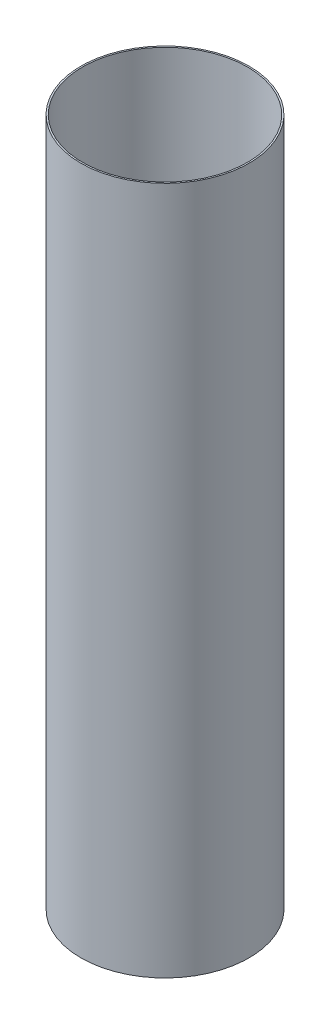
ISO-10303-21;
HEADER;
FILE_DESCRIPTION(('STEP AP214'),'2;1');
FILE_NAME('part.step','',(''),(''),'','','');
FILE_SCHEMA(('AUTOMOTIVE_DESIGN { 1 0 10303 214 1 1 1 1 }'));
ENDSEC;
DATA;
#1=APPLICATION_CONTEXT('core data for automotive mechanical design processes');
#2=APPLICATION_PROTOCOL_DEFINITION('international standard','automotive_design',2000,#1);
#3=PRODUCT_CONTEXT('',#1,'mechanical');
#4=PRODUCT('Part','Part','',(#3));
#5=PRODUCT_RELATED_PRODUCT_CATEGORY('part','',(#4));
#6=PRODUCT_DEFINITION_FORMATION('','',#4);
#7=PRODUCT_DEFINITION_CONTEXT('part definition',#1,'design');
#8=PRODUCT_DEFINITION('design','',#6,#7);
#9=PRODUCT_DEFINITION_SHAPE('','',#8);
#10=(LENGTH_UNIT() NAMED_UNIT(*) SI_UNIT(.MILLI.,.METRE.));
#11=(NAMED_UNIT(*) PLANE_ANGLE_UNIT() SI_UNIT($,.RADIAN.));
#12=(NAMED_UNIT(*) SI_UNIT($,.STERADIAN.) SOLID_ANGLE_UNIT());
#13=UNCERTAINTY_MEASURE_WITH_UNIT(LENGTH_MEASURE(1.E-05),#10,'distance_accuracy_value','');
#14=(GEOMETRIC_REPRESENTATION_CONTEXT(3) GLOBAL_UNCERTAINTY_ASSIGNED_CONTEXT((#13)) GLOBAL_UNIT_ASSIGNED_CONTEXT((#10,
#11,#12)) REPRESENTATION_CONTEXT('',''));
#15=CARTESIAN_POINT('',(0.,0.,0.));
#16=DIRECTION('',(0.,0.,1.));
#17=DIRECTION('',(1.,0.,0.));
#18=AXIS2_PLACEMENT_3D('',#15,#16,#17);
#19=CARTESIAN_POINT('',(0.,317.5,0.));
#20=DIRECTION('',(0.,1.,0.));
#21=DIRECTION('',(0.,0.,1.));
#22=AXIS2_PLACEMENT_3D('',#19,#20,#21);
#23=PLANE('',#22);
#24=CARTESIAN_POINT('',(0.,317.5,0.));
#25=DIRECTION('',(0.,1.,0.));
#26=DIRECTION('',(0.,0.,1.));
#27=AXIS2_PLACEMENT_3D('',#24,#25,#26);
#28=CIRCLE('',#27,77.6224);
#29=CARTESIAN_POINT('',(0.,317.5,-77.6224));
#30=VERTEX_POINT('',#29);
#31=EDGE_CURVE('E10',#30,#30,#28,.T.);
#32=ORIENTED_EDGE('',*,*,#31,.T.);
#33=EDGE_LOOP('',(#32));
#34=FACE_BOUND('',#33,.T.);
#35=CARTESIAN_POINT('',(0.,317.5,0.));
#36=DIRECTION('',(0.,1.,0.));
#37=DIRECTION('',(0.,0.,1.));
#38=AXIS2_PLACEMENT_3D('',#35,#36,#37);
#39=CIRCLE('',#38,76.2);
#40=CARTESIAN_POINT('',(0.,317.5,-76.2));
#41=VERTEX_POINT('',#40);
#42=EDGE_CURVE('E51',#41,#41,#39,.T.);
#43=ORIENTED_EDGE('',*,*,#42,.F.);
#44=EDGE_LOOP('',(#43));
#45=FACE_BOUND('',#44,.T.);
#46=ADVANCED_FACE('F37',(#34,#45),#23,.T.);
#47=CARTESIAN_POINT('',(0.,-317.5,0.));
#48=DIRECTION('',(0.,1.,0.));
#49=DIRECTION('',(0.,0.,1.));
#50=AXIS2_PLACEMENT_3D('',#47,#48,#49);
#51=PLANE('',#50);
#52=CARTESIAN_POINT('',(0.,-317.5,0.));
#53=DIRECTION('',(0.,1.,0.));
#54=DIRECTION('',(0.,0.,1.));
#55=AXIS2_PLACEMENT_3D('',#52,#53,#54);
#56=CIRCLE('',#55,77.6224);
#57=CARTESIAN_POINT('',(0.,-317.5,-77.6224));
#58=VERTEX_POINT('',#57);
#59=EDGE_CURVE('E41',#58,#58,#56,.T.);
#60=ORIENTED_EDGE('',*,*,#59,.F.);
#61=EDGE_LOOP('',(#60));
#62=FACE_BOUND('',#61,.T.);
#63=CARTESIAN_POINT('',(0.,-317.5,0.));
#64=DIRECTION('',(0.,1.,0.));
#65=DIRECTION('',(0.,0.,1.));
#66=AXIS2_PLACEMENT_3D('',#63,#64,#65);
#67=CIRCLE('',#66,76.2);
#68=CARTESIAN_POINT('',(0.,-317.5,-76.2));
#69=VERTEX_POINT('',#68);
#70=EDGE_CURVE('E53',#69,#69,#67,.T.);
#71=ORIENTED_EDGE('',*,*,#70,.T.);
#72=EDGE_LOOP('',(#71));
#73=FACE_BOUND('',#72,.T.);
#74=ADVANCED_FACE('F66',(#62,#73),#51,.F.);
#75=CARTESIAN_POINT('',(0.,317.5,0.));
#76=DIRECTION('',(0.,-1.,0.));
#77=DIRECTION('',(0.,0.,-1.));
#78=AXIS2_PLACEMENT_3D('',#75,#76,#77);
#79=CYLINDRICAL_SURFACE('',#78,77.6224);
#80=CARTESIAN_POINT('',(0.,317.5,-77.6224));
#81=CARTESIAN_POINT('',(0.,310.885416666667,-77.6224));
#82=CARTESIAN_POINT('',(0.,304.270833333333,-77.6224));
#83=CARTESIAN_POINT('',(0.,291.041666666667,-77.6224));
#84=CARTESIAN_POINT('',(0.,284.427083333333,-77.6224));
#85=CARTESIAN_POINT('',(0.,271.197916666667,-77.6224));
#86=CARTESIAN_POINT('',(0.,264.583333333333,-77.6224));
#87=CARTESIAN_POINT('',(0.,251.354166666667,-77.6224));
#88=CARTESIAN_POINT('',(0.,244.739583333333,-77.6224));
#89=CARTESIAN_POINT('',(0.,231.510416666667,-77.6224));
#90=CARTESIAN_POINT('',(0.,224.895833333333,-77.6224));
#91=CARTESIAN_POINT('',(0.,211.666666666667,-77.6224));
#92=CARTESIAN_POINT('',(0.,205.052083333333,-77.6224));
#93=CARTESIAN_POINT('',(0.,191.822916666667,-77.6224));
#94=CARTESIAN_POINT('',(0.,185.208333333333,-77.6224));
#95=CARTESIAN_POINT('',(0.,171.979166666667,-77.6224));
#96=CARTESIAN_POINT('',(0.,165.364583333333,-77.6224));
#97=CARTESIAN_POINT('',(0.,152.135416666667,-77.6224));
#98=CARTESIAN_POINT('',(0.,145.520833333333,-77.6224));
#99=CARTESIAN_POINT('',(0.,132.291666666667,-77.6224));
#100=CARTESIAN_POINT('',(0.,125.677083333333,-77.6224));
#101=CARTESIAN_POINT('',(0.,112.447916666667,-77.6224));
#102=CARTESIAN_POINT('',(0.,105.833333333333,-77.6224));
#103=CARTESIAN_POINT('',(0.,92.6041666666666,-77.6224));
#104=CARTESIAN_POINT('',(0.,85.9895833333332,-77.6224));
#105=CARTESIAN_POINT('',(0.,72.7604166666666,-77.6224));
#106=CARTESIAN_POINT('',(0.,66.1458333333333,-77.6224));
#107=CARTESIAN_POINT('',(0.,52.9166666666666,-77.6224));
#108=CARTESIAN_POINT('',(0.,46.3020833333332,-77.6224));
#109=CARTESIAN_POINT('',(0.,33.0729166666666,-77.6224));
#110=CARTESIAN_POINT('',(0.,26.4583333333332,-77.6224));
#111=CARTESIAN_POINT('',(0.,13.2291666666665,-77.6224));
#112=CARTESIAN_POINT('',(0.,6.61458333333322,-77.6224));
#113=CARTESIAN_POINT('',(0.,-6.61458333333344,-77.6224));
#114=CARTESIAN_POINT('',(0.,-13.2291666666668,-77.6224));
#115=CARTESIAN_POINT('',(0.,-26.4583333333334,-77.6224));
#116=CARTESIAN_POINT('',(0.,-33.0729166666668,-77.6224));
#117=CARTESIAN_POINT('',(0.,-46.3020833333334,-77.6224));
#118=CARTESIAN_POINT('',(0.,-52.9166666666668,-77.6224));
#119=CARTESIAN_POINT('',(0.,-66.1458333333335,-77.6224));
#120=CARTESIAN_POINT('',(0.,-72.7604166666668,-77.6224));
#121=CARTESIAN_POINT('',(0.,-85.9895833333335,-77.6224));
#122=CARTESIAN_POINT('',(0.,-92.6041666666668,-77.6224));
#123=CARTESIAN_POINT('',(0.,-105.833333333333,-77.6224));
#124=CARTESIAN_POINT('',(0.,-112.447916666667,-77.6224));
#125=CARTESIAN_POINT('',(0.,-125.677083333334,-77.6224));
#126=CARTESIAN_POINT('',(0.,-132.291666666667,-77.6224));
#127=CARTESIAN_POINT('',(0.,-145.520833333334,-77.6224));
#128=CARTESIAN_POINT('',(0.,-152.135416666667,-77.6224));
#129=CARTESIAN_POINT('',(0.,-165.364583333334,-77.6224));
#130=CARTESIAN_POINT('',(0.,-171.979166666667,-77.6224));
#131=CARTESIAN_POINT('',(0.,-185.208333333333,-77.6224));
#132=CARTESIAN_POINT('',(0.,-191.822916666667,-77.6224));
#133=CARTESIAN_POINT('',(0.,-205.052083333333,-77.6224));
#134=CARTESIAN_POINT('',(0.,-211.666666666667,-77.6224));
#135=CARTESIAN_POINT('',(0.,-224.895833333333,-77.6224));
#136=CARTESIAN_POINT('',(0.,-231.510416666667,-77.6224));
#137=CARTESIAN_POINT('',(0.,-244.739583333333,-77.6224));
#138=CARTESIAN_POINT('',(0.,-251.354166666667,-77.6224));
#139=CARTESIAN_POINT('',(0.,-264.583333333333,-77.6224));
#140=CARTESIAN_POINT('',(0.,-271.197916666667,-77.6224));
#141=CARTESIAN_POINT('',(0.,-284.427083333333,-77.6224));
#142=CARTESIAN_POINT('',(0.,-291.041666666667,-77.6224));
#143=CARTESIAN_POINT('',(0.,-304.270833333333,-77.6224));
#144=CARTESIAN_POINT('',(0.,-310.885416666667,-77.6224));
#145=CARTESIAN_POINT('',(0.,-317.5,-77.6224));
#146=B_SPLINE_CURVE_WITH_KNOTS('',3,(#80,#81,#82,#83,#84,#85,#86,#87,#88,#89,#90,#91,#92,#93,
#94,#95,#96,#97,#98,#99,#100,#101,#102,#103,#104,#105,#106,#107,#108,#109,#110,#111,#112,#113,
#114,#115,#116,#117,#118,#119,#120,#121,#122,#123,#124,#125,#126,#127,#128,#129,#130,#131,#132,
#133,#134,#135,#136,#137,#138,#139,#140,#141,#142,#143,#144,#145),.UNSPECIFIED.,.F.,.F.,(4,2,2,
2,2,2,2,2,2,2,2,2,2,2,2,2,2,2,2,2,2,2,2,2,2,2,2,2,2,2,2,2,4),(0.,19.84375,39.6875,59.53125,
79.375,99.21875,119.0625,138.90625,158.75,178.59375,198.4375,218.28125,238.125,257.96875,
277.8125,297.65625,317.5,337.34375,357.1875,377.03125,396.875,416.71875,436.5625,456.40625,
476.25,496.09375,515.9375,535.78125,555.625,575.46875,595.3125,615.15625,635.),.UNSPECIFIED.);
#147=EDGE_CURVE('BSEAM39',#30,#58,#146,.T.);
#148=ORIENTED_EDGE('',*,*,#31,.F.);
#149=ORIENTED_EDGE('',*,*,#59,.T.);
#150=ORIENTED_EDGE('',*,*,#147,.T.);
#151=ORIENTED_EDGE('',*,*,#147,.F.);
#152=EDGE_LOOP('',(#148,#150,#149,#151));
#153=FACE_BOUND('',#152,.T.);
#154=ADVANCED_FACE('F39',(#153),#79,.T.);
#155=CARTESIAN_POINT('',(0.,317.5,0.));
#156=DIRECTION('',(0.,-1.,0.));
#157=DIRECTION('',(0.,0.,-1.));
#158=AXIS2_PLACEMENT_3D('',#155,#156,#157);
#159=CYLINDRICAL_SURFACE('',#158,76.2);
#160=CARTESIAN_POINT('',(0.,317.5,-76.2));
#161=CARTESIAN_POINT('',(0.,310.885416666667,-76.2));
#162=CARTESIAN_POINT('',(0.,304.270833333333,-76.2));
#163=CARTESIAN_POINT('',(0.,291.041666666667,-76.2));
#164=CARTESIAN_POINT('',(0.,284.427083333333,-76.2));
#165=CARTESIAN_POINT('',(0.,271.197916666667,-76.2));
#166=CARTESIAN_POINT('',(0.,264.583333333333,-76.2));
#167=CARTESIAN_POINT('',(0.,251.354166666667,-76.2));
#168=CARTESIAN_POINT('',(0.,244.739583333333,-76.2));
#169=CARTESIAN_POINT('',(0.,231.510416666667,-76.2));
#170=CARTESIAN_POINT('',(0.,224.895833333333,-76.2));
#171=CARTESIAN_POINT('',(0.,211.666666666667,-76.2));
#172=CARTESIAN_POINT('',(0.,205.052083333333,-76.2));
#173=CARTESIAN_POINT('',(0.,191.822916666667,-76.2));
#174=CARTESIAN_POINT('',(0.,185.208333333333,-76.2));
#175=CARTESIAN_POINT('',(0.,171.979166666667,-76.2));
#176=CARTESIAN_POINT('',(0.,165.364583333333,-76.2));
#177=CARTESIAN_POINT('',(0.,152.135416666667,-76.2));
#178=CARTESIAN_POINT('',(0.,145.520833333333,-76.2));
#179=CARTESIAN_POINT('',(0.,132.291666666667,-76.2));
#180=CARTESIAN_POINT('',(0.,125.677083333333,-76.2));
#181=CARTESIAN_POINT('',(0.,112.447916666667,-76.2));
#182=CARTESIAN_POINT('',(0.,105.833333333333,-76.2));
#183=CARTESIAN_POINT('',(0.,92.6041666666666,-76.2));
#184=CARTESIAN_POINT('',(0.,85.9895833333332,-76.2));
#185=CARTESIAN_POINT('',(0.,72.7604166666666,-76.2));
#186=CARTESIAN_POINT('',(0.,66.1458333333333,-76.2));
#187=CARTESIAN_POINT('',(0.,52.9166666666666,-76.2));
#188=CARTESIAN_POINT('',(0.,46.3020833333333,-76.2));
#189=CARTESIAN_POINT('',(0.,33.0729166666666,-76.2));
#190=CARTESIAN_POINT('',(0.,26.4583333333333,-76.2));
#191=CARTESIAN_POINT('',(0.,13.2291666666666,-76.2));
#192=CARTESIAN_POINT('',(0.,6.61458333333328,-76.2));
#193=CARTESIAN_POINT('',(0.,-6.61458333333339,-76.2));
#194=CARTESIAN_POINT('',(0.,-13.2291666666667,-76.2));
#195=CARTESIAN_POINT('',(0.,-26.4583333333334,-76.2));
#196=CARTESIAN_POINT('',(0.,-33.0729166666667,-76.2));
#197=CARTESIAN_POINT('',(0.,-46.3020833333334,-76.2));
#198=CARTESIAN_POINT('',(0.,-52.9166666666667,-76.2));
#199=CARTESIAN_POINT('',(0.,-66.1458333333334,-76.2));
#200=CARTESIAN_POINT('',(0.,-72.7604166666668,-76.2));
#201=CARTESIAN_POINT('',(0.,-85.9895833333334,-76.2));
#202=CARTESIAN_POINT('',(0.,-92.6041666666668,-76.2));
#203=CARTESIAN_POINT('',(0.,-105.833333333333,-76.2));
#204=CARTESIAN_POINT('',(0.,-112.447916666667,-76.2));
#205=CARTESIAN_POINT('',(0.,-125.677083333333,-76.2));
#206=CARTESIAN_POINT('',(0.,-132.291666666667,-76.2));
#207=CARTESIAN_POINT('',(0.,-145.520833333333,-76.2));
#208=CARTESIAN_POINT('',(0.,-152.135416666667,-76.2));
#209=CARTESIAN_POINT('',(0.,-165.364583333333,-76.2));
#210=CARTESIAN_POINT('',(0.,-171.979166666667,-76.2));
#211=CARTESIAN_POINT('',(0.,-185.208333333333,-76.2));
#212=CARTESIAN_POINT('',(0.,-191.822916666667,-76.2));
#213=CARTESIAN_POINT('',(0.,-205.052083333333,-76.2));
#214=CARTESIAN_POINT('',(0.,-211.666666666667,-76.2));
#215=CARTESIAN_POINT('',(0.,-224.895833333333,-76.2));
#216=CARTESIAN_POINT('',(0.,-231.510416666667,-76.2));
#217=CARTESIAN_POINT('',(0.,-244.739583333333,-76.2));
#218=CARTESIAN_POINT('',(0.,-251.354166666667,-76.2));
#219=CARTESIAN_POINT('',(0.,-264.583333333333,-76.2));
#220=CARTESIAN_POINT('',(0.,-271.197916666667,-76.2));
#221=CARTESIAN_POINT('',(0.,-284.427083333333,-76.2));
#222=CARTESIAN_POINT('',(0.,-291.041666666667,-76.2));
#223=CARTESIAN_POINT('',(0.,-304.270833333333,-76.2));
#224=CARTESIAN_POINT('',(0.,-310.885416666667,-76.2));
#225=CARTESIAN_POINT('',(0.,-317.5,-76.2));
#226=B_SPLINE_CURVE_WITH_KNOTS('',3,(#160,#161,#162,#163,#164,#165,#166,#167,#168,#169,#170,
#171,#172,#173,#174,#175,#176,#177,#178,#179,#180,#181,#182,#183,#184,#185,#186,#187,#188,#189,
#190,#191,#192,#193,#194,#195,#196,#197,#198,#199,#200,#201,#202,#203,#204,#205,#206,#207,#208,
#209,#210,#211,#212,#213,#214,#215,#216,#217,#218,#219,#220,#221,#222,#223,#224,#225),
.UNSPECIFIED.,.F.,.F.,(4,2,2,2,2,2,2,2,2,2,2,2,2,2,2,2,2,2,2,2,2,2,2,2,2,2,2,2,2,2,2,2,4),(0.,
19.84375,39.6875,59.53125,79.375,99.2187500000001,119.0625,138.90625,158.75,178.59375,198.4375,
218.28125,238.125,257.96875,277.8125,297.65625,317.5,337.34375,357.1875,377.03125,396.875,
416.71875,436.5625,456.40625,476.25,496.09375,515.9375,535.78125,555.625,575.46875,595.3125,
615.15625,635.),.UNSPECIFIED.);
#227=EDGE_CURVE('BSEAM62',#41,#69,#226,.T.);
#228=ORIENTED_EDGE('',*,*,#42,.T.);
#229=ORIENTED_EDGE('',*,*,#70,.F.);
#230=ORIENTED_EDGE('',*,*,#227,.T.);
#231=ORIENTED_EDGE('',*,*,#227,.F.);
#232=EDGE_LOOP('',(#228,#230,#229,#231));
#233=FACE_BOUND('',#232,.T.);
#234=ADVANCED_FACE('F62',(#233),#159,.F.);
#235=CLOSED_SHELL('',(#46,#74,#154,#234));
#236=MANIFOLD_SOLID_BREP('B2',#235);
#237=ADVANCED_BREP_SHAPE_REPRESENTATION('',(#18,#236),#14);
#238=SHAPE_DEFINITION_REPRESENTATION(#9,#237);
ENDSEC;
END-ISO-10303-21;
